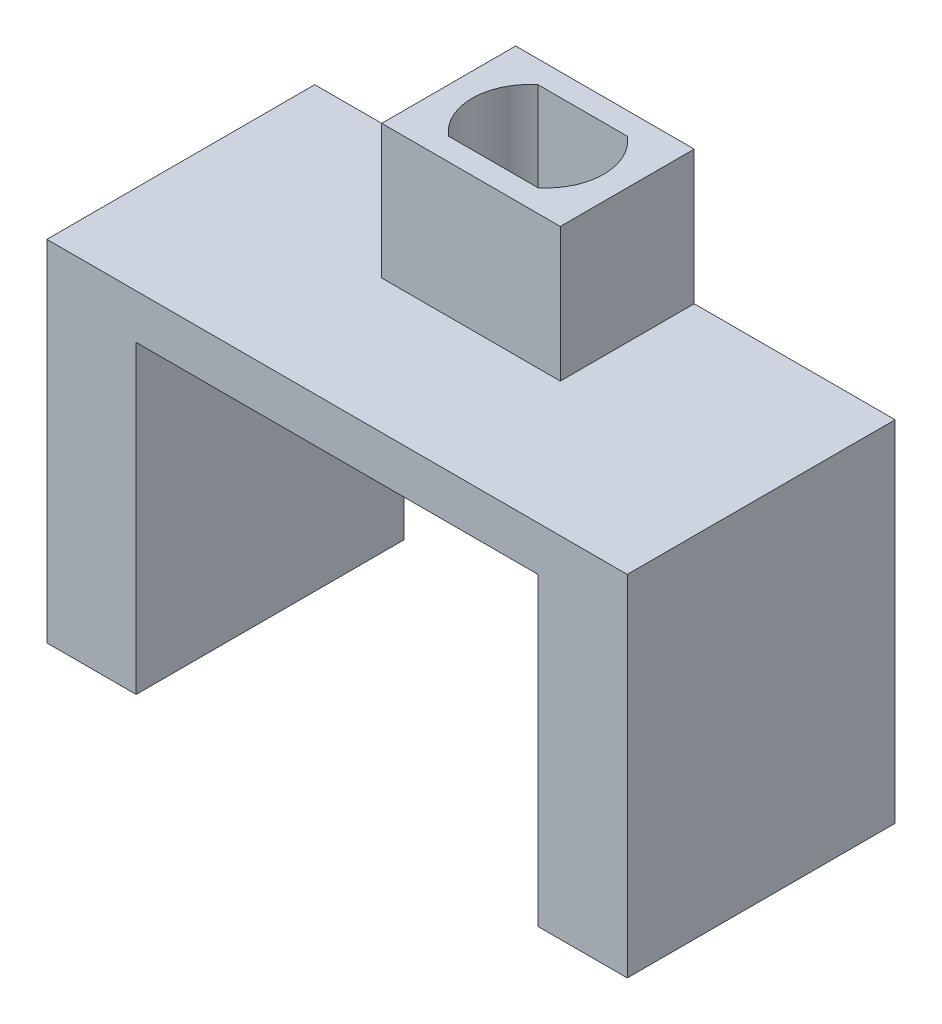
ISO-10303-21;
HEADER;
FILE_DESCRIPTION(('STEP AP214'),'2;1');
FILE_NAME('part.step','',(''),(''),'','','');
FILE_SCHEMA(('AUTOMOTIVE_DESIGN { 1 0 10303 214 1 1 1 1 }'));
ENDSEC;
DATA;
#1=APPLICATION_CONTEXT('core data for automotive mechanical design processes');
#2=APPLICATION_PROTOCOL_DEFINITION('international standard','automotive_design',2000,#1);
#3=PRODUCT_CONTEXT('',#1,'mechanical');
#4=PRODUCT('Part','Part','',(#3));
#5=PRODUCT_RELATED_PRODUCT_CATEGORY('part','',(#4));
#6=PRODUCT_DEFINITION_FORMATION('','',#4);
#7=PRODUCT_DEFINITION_CONTEXT('part definition',#1,'design');
#8=PRODUCT_DEFINITION('design','',#6,#7);
#9=PRODUCT_DEFINITION_SHAPE('','',#8);
#10=(LENGTH_UNIT() NAMED_UNIT(*) SI_UNIT(.MILLI.,.METRE.));
#11=(NAMED_UNIT(*) PLANE_ANGLE_UNIT() SI_UNIT($,.RADIAN.));
#12=(NAMED_UNIT(*) SI_UNIT($,.STERADIAN.) SOLID_ANGLE_UNIT());
#13=UNCERTAINTY_MEASURE_WITH_UNIT(LENGTH_MEASURE(1.E-05),#10,'distance_accuracy_value','');
#14=(GEOMETRIC_REPRESENTATION_CONTEXT(3) GLOBAL_UNCERTAINTY_ASSIGNED_CONTEXT((#13)) GLOBAL_UNIT_ASSIGNED_CONTEXT((#10,
#11,#12)) REPRESENTATION_CONTEXT('',''));
#15=CARTESIAN_POINT('',(0.,0.,0.));
#16=DIRECTION('',(0.,0.,1.));
#17=DIRECTION('',(1.,0.,0.));
#18=AXIS2_PLACEMENT_3D('',#15,#16,#17);
#19=CARTESIAN_POINT('',(0.,0.,0.));
#20=DIRECTION('',(0.,-1.,0.));
#21=DIRECTION('',(0.,0.,-1.));
#22=AXIS2_PLACEMENT_3D('',#19,#20,#21);
#23=PLANE('',#22);
#24=CARTESIAN_POINT('',(0.,0.,-7.5));
#25=DIRECTION('',(0.,1.,0.));
#26=DIRECTION('',(0.,0.,1.));
#27=AXIS2_PLACEMENT_3D('',#24,#25,#26);
#28=CIRCLE('',#27,1.85264170744092);
#29=CARTESIAN_POINT('',(0.,0.,-5.64735829255908));
#30=VERTEX_POINT('',#29);
#31=EDGE_CURVE('E226',#30,#30,#28,.T.);
#32=ORIENTED_EDGE('',*,*,#31,.T.);
#33=EDGE_LOOP('',(#32));
#34=FACE_BOUND('',#33,.T.);
#35=DIRECTION('',(1.,0.,0.));
#36=VECTOR('',#35,1.);
#37=CARTESIAN_POINT('',(-32.5,0.,15.));
#38=LINE('',#37,#36);
#39=CARTESIAN_POINT('',(-22.5,0.,15.));
#40=VERTEX_POINT('',#39);
#41=CARTESIAN_POINT('',(22.5,0.,15.));
#42=VERTEX_POINT('',#41);
#43=EDGE_CURVE('E52',#40,#42,#38,.T.);
#44=ORIENTED_EDGE('',*,*,#43,.F.);
#45=DIRECTION('',(0.,0.,1.));
#46=VECTOR('',#45,1.);
#47=CARTESIAN_POINT('',(-22.5,0.,-15.));
#48=LINE('',#47,#46);
#49=CARTESIAN_POINT('',(-22.5,0.,-15.));
#50=VERTEX_POINT('',#49);
#51=EDGE_CURVE('E156',#50,#40,#48,.T.);
#52=ORIENTED_EDGE('',*,*,#51,.F.);
#53=DIRECTION('',(-1.,0.,0.));
#54=VECTOR('',#53,1.);
#55=CARTESIAN_POINT('',(-32.5,0.,-15.));
#56=LINE('',#55,#54);
#57=CARTESIAN_POINT('',(22.5,0.,-15.));
#58=VERTEX_POINT('',#57);
#59=EDGE_CURVE('E165',#58,#50,#56,.T.);
#60=ORIENTED_EDGE('',*,*,#59,.F.);
#61=DIRECTION('',(0.,0.,-1.));
#62=VECTOR('',#61,1.);
#63=CARTESIAN_POINT('',(22.5,0.,-15.));
#64=LINE('',#63,#62);
#65=EDGE_CURVE('E202',#42,#58,#64,.T.);
#66=ORIENTED_EDGE('',*,*,#65,.F.);
#67=EDGE_LOOP('',(#44,#52,#60,#66));
#68=FACE_BOUND('',#67,.T.);
#69=ADVANCED_FACE('F37',(#34,#68),#23,.T.);
#70=CARTESIAN_POINT('',(0.,5.,0.));
#71=DIRECTION('',(0.,-1.,0.));
#72=DIRECTION('',(0.,0.,-1.));
#73=AXIS2_PLACEMENT_3D('',#70,#71,#72);
#74=PLANE('',#73);
#75=DIRECTION('',(0.,0.,-1.));
#76=VECTOR('',#75,1.);
#77=CARTESIAN_POINT('',(9.99999999999999,5.,-15.));
#78=LINE('',#77,#76);
#79=CARTESIAN_POINT('',(9.99999999999999,5.,0.));
#80=VERTEX_POINT('',#79);
#81=CARTESIAN_POINT('',(9.99999999999999,5.,-15.));
#82=VERTEX_POINT('',#81);
#83=EDGE_CURVE('E261',#80,#82,#78,.T.);
#84=ORIENTED_EDGE('',*,*,#83,.F.);
#85=DIRECTION('',(1.,0.,0.));
#86=VECTOR('',#85,1.);
#87=CARTESIAN_POINT('',(-10.,5.,0.));
#88=LINE('',#87,#86);
#89=CARTESIAN_POINT('',(-10.,5.,0.));
#90=VERTEX_POINT('',#89);
#91=EDGE_CURVE('E266',#90,#80,#88,.T.);
#92=ORIENTED_EDGE('',*,*,#91,.F.);
#93=DIRECTION('',(0.,0.,1.));
#94=VECTOR('',#93,1.);
#95=CARTESIAN_POINT('',(-10.,5.,-15.));
#96=LINE('',#95,#94);
#97=CARTESIAN_POINT('',(-10.,5.,-15.));
#98=VERTEX_POINT('',#97);
#99=EDGE_CURVE('E275',#98,#90,#96,.T.);
#100=ORIENTED_EDGE('',*,*,#99,.F.);
#101=DIRECTION('',(-1.,0.,0.));
#102=VECTOR('',#101,1.);
#103=CARTESIAN_POINT('',(-32.5,5.,-15.));
#104=LINE('',#103,#102);
#105=CARTESIAN_POINT('',(-32.5,5.,-15.));
#106=VERTEX_POINT('',#105);
#107=EDGE_CURVE('E289',#98,#106,#104,.T.);
#108=ORIENTED_EDGE('',*,*,#107,.T.);
#109=DIRECTION('',(0.,0.,1.));
#110=VECTOR('',#109,1.);
#111=CARTESIAN_POINT('',(-32.5,5.,15.));
#112=LINE('',#111,#110);
#113=CARTESIAN_POINT('',(-32.5,5.,15.));
#114=VERTEX_POINT('',#113);
#115=EDGE_CURVE('E195',#106,#114,#112,.T.);
#116=ORIENTED_EDGE('',*,*,#115,.T.);
#117=DIRECTION('',(1.,0.,0.));
#118=VECTOR('',#117,1.);
#119=CARTESIAN_POINT('',(-32.5,5.,15.));
#120=LINE('',#119,#118);
#121=CARTESIAN_POINT('',(32.5,5.,15.));
#122=VERTEX_POINT('',#121);
#123=EDGE_CURVE('E181',#114,#122,#120,.T.);
#124=ORIENTED_EDGE('',*,*,#123,.T.);
#125=DIRECTION('',(0.,0.,-1.));
#126=VECTOR('',#125,1.);
#127=CARTESIAN_POINT('',(32.5,5.,15.));
#128=LINE('',#127,#126);
#129=CARTESIAN_POINT('',(32.5,5.,-15.));
#130=VERTEX_POINT('',#129);
#131=EDGE_CURVE('E175',#122,#130,#128,.T.);
#132=ORIENTED_EDGE('',*,*,#131,.T.);
#133=EDGE_CURVE('E290',#130,#82,#104,.T.);
#134=ORIENTED_EDGE('',*,*,#133,.T.);
#135=EDGE_LOOP('',(#84,#92,#100,#108,#116,#124,#132,#134));
#136=FACE_BOUND('',#135,.T.);
#137=ADVANCED_FACE('F294',(#136),#74,.F.);
#138=CARTESIAN_POINT('',(32.5,5.,15.));
#139=DIRECTION('',(-1.,0.,0.));
#140=DIRECTION('',(0.,0.,1.));
#141=AXIS2_PLACEMENT_3D('',#138,#139,#140);
#142=PLANE('',#141);
#143=DIRECTION('',(0.,-1.,0.));
#144=VECTOR('',#143,1.);
#145=CARTESIAN_POINT('',(32.5,5.,15.));
#146=LINE('',#145,#144);
#147=CARTESIAN_POINT('',(32.5,-34.1462129049531,15.));
#148=VERTEX_POINT('',#147);
#149=EDGE_CURVE('E184',#122,#148,#146,.T.);
#150=ORIENTED_EDGE('',*,*,#149,.T.);
#151=DIRECTION('',(0.,0.,-1.));
#152=VECTOR('',#151,1.);
#153=CARTESIAN_POINT('',(32.5,-34.1462129049531,-15.));
#154=LINE('',#153,#152);
#155=CARTESIAN_POINT('',(32.5,-34.1462129049531,-15.));
#156=VERTEX_POINT('',#155);
#157=EDGE_CURVE('E216',#148,#156,#154,.T.);
#158=ORIENTED_EDGE('',*,*,#157,.T.);
#159=DIRECTION('',(0.,-1.,0.));
#160=VECTOR('',#159,1.);
#161=CARTESIAN_POINT('',(32.5,5.,-15.));
#162=LINE('',#161,#160);
#163=EDGE_CURVE('E11',#130,#156,#162,.T.);
#164=ORIENTED_EDGE('',*,*,#163,.F.);
#165=ORIENTED_EDGE('',*,*,#131,.F.);
#166=EDGE_LOOP('',(#150,#158,#164,#165));
#167=FACE_BOUND('',#166,.T.);
#168=ADVANCED_FACE('F39',(#167),#142,.F.);
#169=CARTESIAN_POINT('',(-32.5,5.,-15.));
#170=DIRECTION('',(0.,0.,1.));
#171=DIRECTION('',(1.,0.,0.));
#172=AXIS2_PLACEMENT_3D('',#169,#170,#171);
#173=PLANE('',#172);
#174=ORIENTED_EDGE('',*,*,#163,.T.);
#175=DIRECTION('',(-1.,0.,0.));
#176=VECTOR('',#175,1.);
#177=CARTESIAN_POINT('',(32.5,-34.1462129049531,-15.));
#178=LINE('',#177,#176);
#179=CARTESIAN_POINT('',(22.5,-34.1462129049531,-15.));
#180=VERTEX_POINT('',#179);
#181=EDGE_CURVE('E213',#156,#180,#178,.T.);
#182=ORIENTED_EDGE('',*,*,#181,.T.);
#183=DIRECTION('',(0.,1.,0.));
#184=VECTOR('',#183,1.);
#185=CARTESIAN_POINT('',(22.5,-65.7689895066369,-15.));
#186=LINE('',#185,#184);
#187=EDGE_CURVE('E171',#180,#58,#186,.T.);
#188=ORIENTED_EDGE('',*,*,#187,.T.);
#189=ORIENTED_EDGE('',*,*,#59,.T.);
#190=DIRECTION('',(0.,1.,0.));
#191=VECTOR('',#190,1.);
#192=CARTESIAN_POINT('',(-22.5,-65.7689895066369,-15.));
#193=LINE('',#192,#191);
#194=CARTESIAN_POINT('',(-22.5,-34.1462129049531,-15.));
#195=VERTEX_POINT('',#194);
#196=EDGE_CURVE('E152',#195,#50,#193,.T.);
#197=ORIENTED_EDGE('',*,*,#196,.F.);
#198=DIRECTION('',(-1.,0.,0.));
#199=VECTOR('',#198,1.);
#200=CARTESIAN_POINT('',(-32.5,-34.1462129049531,-15.));
#201=LINE('',#200,#199);
#202=CARTESIAN_POINT('',(-32.5,-34.1462129049531,-15.));
#203=VERTEX_POINT('',#202);
#204=EDGE_CURVE('E200',#195,#203,#201,.T.);
#205=ORIENTED_EDGE('',*,*,#204,.T.);
#206=DIRECTION('',(0.,-1.,0.));
#207=VECTOR('',#206,1.);
#208=CARTESIAN_POINT('',(-32.5,5.,-15.));
#209=LINE('',#208,#207);
#210=EDGE_CURVE('E45',#106,#203,#209,.T.);
#211=ORIENTED_EDGE('',*,*,#210,.F.);
#212=ORIENTED_EDGE('',*,*,#107,.F.);
#213=DIRECTION('',(0.,-1.,0.));
#214=VECTOR('',#213,1.);
#215=CARTESIAN_POINT('',(-10.,20.,-15.));
#216=LINE('',#215,#214);
#217=CARTESIAN_POINT('',(-10.,20.,-15.));
#218=VERTEX_POINT('',#217);
#219=EDGE_CURVE('E178',#218,#98,#216,.T.);
#220=ORIENTED_EDGE('',*,*,#219,.F.);
#221=DIRECTION('',(-1.,0.,0.));
#222=VECTOR('',#221,1.);
#223=CARTESIAN_POINT('',(-10.,20.,-15.));
#224=LINE('',#223,#222);
#225=CARTESIAN_POINT('',(9.99999999999999,20.,-15.));
#226=VERTEX_POINT('',#225);
#227=EDGE_CURVE('E265',#226,#218,#224,.T.);
#228=ORIENTED_EDGE('',*,*,#227,.F.);
#229=DIRECTION('',(0.,-1.,0.));
#230=VECTOR('',#229,1.);
#231=CARTESIAN_POINT('',(9.99999999999999,20.,-15.));
#232=LINE('',#231,#230);
#233=EDGE_CURVE('E173',#226,#82,#232,.T.);
#234=ORIENTED_EDGE('',*,*,#233,.T.);
#235=ORIENTED_EDGE('',*,*,#133,.F.);
#236=EDGE_LOOP('',(#174,#182,#188,#189,#197,#205,#211,#212,#220,#228,#234,#235));
#237=FACE_BOUND('',#236,.T.);
#238=ADVANCED_FACE('F168',(#237),#173,.F.);
#239=CARTESIAN_POINT('',(-32.5,5.,15.));
#240=DIRECTION('',(1.,0.,0.));
#241=DIRECTION('',(0.,0.,-1.));
#242=AXIS2_PLACEMENT_3D('',#239,#240,#241);
#243=PLANE('',#242);
#244=ORIENTED_EDGE('',*,*,#210,.T.);
#245=DIRECTION('',(0.,0.,1.));
#246=VECTOR('',#245,1.);
#247=CARTESIAN_POINT('',(-32.5,-34.1462129049531,-15.));
#248=LINE('',#247,#246);
#249=CARTESIAN_POINT('',(-32.5,-34.1462129049531,15.));
#250=VERTEX_POINT('',#249);
#251=EDGE_CURVE('E194',#203,#250,#248,.T.);
#252=ORIENTED_EDGE('',*,*,#251,.T.);
#253=DIRECTION('',(0.,-1.,0.));
#254=VECTOR('',#253,1.);
#255=CARTESIAN_POINT('',(-32.5,5.,15.));
#256=LINE('',#255,#254);
#257=EDGE_CURVE('E186',#114,#250,#256,.T.);
#258=ORIENTED_EDGE('',*,*,#257,.F.);
#259=ORIENTED_EDGE('',*,*,#115,.F.);
#260=EDGE_LOOP('',(#244,#252,#258,#259));
#261=FACE_BOUND('',#260,.T.);
#262=ADVANCED_FACE('F192',(#261),#243,.F.);
#263=CARTESIAN_POINT('',(-32.5,5.,15.));
#264=DIRECTION('',(0.,0.,-1.));
#265=DIRECTION('',(-1.,0.,0.));
#266=AXIS2_PLACEMENT_3D('',#263,#264,#265);
#267=PLANE('',#266);
#268=ORIENTED_EDGE('',*,*,#257,.T.);
#269=DIRECTION('',(1.,0.,0.));
#270=VECTOR('',#269,1.);
#271=CARTESIAN_POINT('',(-32.5,-34.1462129049531,15.));
#272=LINE('',#271,#270);
#273=CARTESIAN_POINT('',(-22.5,-34.1462129049531,15.));
#274=VERTEX_POINT('',#273);
#275=EDGE_CURVE('E161',#250,#274,#272,.T.);
#276=ORIENTED_EDGE('',*,*,#275,.T.);
#277=DIRECTION('',(0.,1.,0.));
#278=VECTOR('',#277,1.);
#279=CARTESIAN_POINT('',(-22.5,-65.7689895066369,15.));
#280=LINE('',#279,#278);
#281=EDGE_CURVE('E162',#274,#40,#280,.T.);
#282=ORIENTED_EDGE('',*,*,#281,.T.);
#283=ORIENTED_EDGE('',*,*,#43,.T.);
#284=DIRECTION('',(0.,1.,0.));
#285=VECTOR('',#284,1.);
#286=CARTESIAN_POINT('',(22.5,-65.7689895066369,15.));
#287=LINE('',#286,#285);
#288=CARTESIAN_POINT('',(22.5,-34.1462129049531,15.));
#289=VERTEX_POINT('',#288);
#290=EDGE_CURVE('E222',#289,#42,#287,.T.);
#291=ORIENTED_EDGE('',*,*,#290,.F.);
#292=DIRECTION('',(1.,0.,0.));
#293=VECTOR('',#292,1.);
#294=CARTESIAN_POINT('',(32.5,-34.1462129049531,15.));
#295=LINE('',#294,#293);
#296=EDGE_CURVE('E212',#289,#148,#295,.T.);
#297=ORIENTED_EDGE('',*,*,#296,.T.);
#298=ORIENTED_EDGE('',*,*,#149,.F.);
#299=ORIENTED_EDGE('',*,*,#123,.F.);
#300=EDGE_LOOP('',(#268,#276,#282,#283,#291,#297,#298,#299));
#301=FACE_BOUND('',#300,.T.);
#302=ADVANCED_FACE('F297',(#301),#267,.F.);
#303=CARTESIAN_POINT('',(9.99999999999999,20.,-15.));
#304=DIRECTION('',(-1.,0.,0.));
#305=DIRECTION('',(0.,0.,1.));
#306=AXIS2_PLACEMENT_3D('',#303,#304,#305);
#307=PLANE('',#306);
#308=ORIENTED_EDGE('',*,*,#83,.T.);
#309=ORIENTED_EDGE('',*,*,#233,.F.);
#310=DIRECTION('',(0.,0.,-1.));
#311=VECTOR('',#310,1.);
#312=CARTESIAN_POINT('',(9.99999999999999,20.,-15.));
#313=LINE('',#312,#311);
#314=CARTESIAN_POINT('',(9.99999999999999,20.,0.));
#315=VERTEX_POINT('',#314);
#316=EDGE_CURVE('E262',#315,#226,#313,.T.);
#317=ORIENTED_EDGE('',*,*,#316,.F.);
#318=DIRECTION('',(0.,-1.,0.));
#319=VECTOR('',#318,1.);
#320=CARTESIAN_POINT('',(9.99999999999999,20.,0.));
#321=LINE('',#320,#319);
#322=EDGE_CURVE('E272',#315,#80,#321,.T.);
#323=ORIENTED_EDGE('',*,*,#322,.T.);
#324=EDGE_LOOP('',(#308,#309,#317,#323));
#325=FACE_BOUND('',#324,.T.);
#326=ADVANCED_FACE('F327',(#325),#307,.F.);
#327=CARTESIAN_POINT('',(-10.,20.,-15.));
#328=DIRECTION('',(1.,0.,0.));
#329=DIRECTION('',(0.,0.,-1.));
#330=AXIS2_PLACEMENT_3D('',#327,#328,#329);
#331=PLANE('',#330);
#332=ORIENTED_EDGE('',*,*,#99,.T.);
#333=DIRECTION('',(0.,-1.,0.));
#334=VECTOR('',#333,1.);
#335=CARTESIAN_POINT('',(-10.,20.,0.));
#336=LINE('',#335,#334);
#337=CARTESIAN_POINT('',(-10.,20.,0.));
#338=VERTEX_POINT('',#337);
#339=EDGE_CURVE('E282',#338,#90,#336,.T.);
#340=ORIENTED_EDGE('',*,*,#339,.F.);
#341=DIRECTION('',(0.,0.,1.));
#342=VECTOR('',#341,1.);
#343=CARTESIAN_POINT('',(-10.,20.,-15.));
#344=LINE('',#343,#342);
#345=EDGE_CURVE('E268',#218,#338,#344,.T.);
#346=ORIENTED_EDGE('',*,*,#345,.F.);
#347=ORIENTED_EDGE('',*,*,#219,.T.);
#348=EDGE_LOOP('',(#332,#340,#346,#347));
#349=FACE_BOUND('',#348,.T.);
#350=ADVANCED_FACE('F350',(#349),#331,.F.);
#351=CARTESIAN_POINT('',(-10.,20.,0.));
#352=DIRECTION('',(0.,0.,-1.));
#353=DIRECTION('',(-1.,0.,0.));
#354=AXIS2_PLACEMENT_3D('',#351,#352,#353);
#355=PLANE('',#354);
#356=ORIENTED_EDGE('',*,*,#91,.T.);
#357=ORIENTED_EDGE('',*,*,#322,.F.);
#358=DIRECTION('',(1.,0.,0.));
#359=VECTOR('',#358,1.);
#360=CARTESIAN_POINT('',(-10.,20.,0.));
#361=LINE('',#360,#359);
#362=EDGE_CURVE('E270',#338,#315,#361,.T.);
#363=ORIENTED_EDGE('',*,*,#362,.F.);
#364=ORIENTED_EDGE('',*,*,#339,.T.);
#365=EDGE_LOOP('',(#356,#357,#363,#364));
#366=FACE_BOUND('',#365,.T.);
#367=ADVANCED_FACE('F359',(#366),#355,.F.);
#368=CARTESIAN_POINT('',(0.,20.,0.));
#369=DIRECTION('',(0.,1.,0.));
#370=DIRECTION('',(0.,0.,1.));
#371=AXIS2_PLACEMENT_3D('',#368,#369,#370);
#372=PLANE('',#371);
#373=DIRECTION('',(-1.,0.,0.));
#374=VECTOR('',#373,1.);
#375=CARTESIAN_POINT('',(-5.,20.,-12.5));
#376=LINE('',#375,#374);
#377=CARTESIAN_POINT('',(5.,20.,-12.5));
#378=VERTEX_POINT('',#377);
#379=CARTESIAN_POINT('',(-5.,20.,-12.5));
#380=VERTEX_POINT('',#379);
#381=EDGE_CURVE('E237',#378,#380,#376,.T.);
#382=ORIENTED_EDGE('',*,*,#381,.F.);
#383=CARTESIAN_POINT('',(0.926240285377159,20.,-7.5));
#384=DIRECTION('',(0.,1.,0.));
#385=DIRECTION('',(0.,0.,1.));
#386=AXIS2_PLACEMENT_3D('',#383,#384,#385);
#387=CIRCLE('',#386,6.44945875345241);
#388=CARTESIAN_POINT('',(5.,20.,-2.5));
#389=VERTEX_POINT('',#388);
#390=EDGE_CURVE('E229',#389,#378,#387,.T.);
#391=ORIENTED_EDGE('',*,*,#390,.F.);
#392=DIRECTION('',(1.,0.,0.));
#393=VECTOR('',#392,1.);
#394=CARTESIAN_POINT('',(-5.,20.,-2.5));
#395=LINE('',#394,#393);
#396=CARTESIAN_POINT('',(-5.,20.,-2.50000000000001));
#397=VERTEX_POINT('',#396);
#398=EDGE_CURVE('E60',#397,#389,#395,.T.);
#399=ORIENTED_EDGE('',*,*,#398,.F.);
#400=CARTESIAN_POINT('',(-0.926240285377159,20.,-7.5));
#401=DIRECTION('',(0.,1.,0.));
#402=DIRECTION('',(0.,0.,1.));
#403=AXIS2_PLACEMENT_3D('',#400,#401,#402);
#404=CIRCLE('',#403,6.44945875345241);
#405=EDGE_CURVE('E234',#380,#397,#404,.T.);
#406=ORIENTED_EDGE('',*,*,#405,.F.);
#407=EDGE_LOOP('',(#382,#391,#399,#406));
#408=FACE_BOUND('',#407,.T.);
#409=ORIENTED_EDGE('',*,*,#316,.T.);
#410=ORIENTED_EDGE('',*,*,#227,.T.);
#411=ORIENTED_EDGE('',*,*,#345,.T.);
#412=ORIENTED_EDGE('',*,*,#362,.T.);
#413=EDGE_LOOP('',(#409,#410,#411,#412));
#414=FACE_BOUND('',#413,.T.);
#415=ADVANCED_FACE('F369',(#408,#414),#372,.T.);
#416=CARTESIAN_POINT('',(0.,5.,0.));
#417=DIRECTION('',(0.,-1.,0.));
#418=DIRECTION('',(0.,0.,-1.));
#419=AXIS2_PLACEMENT_3D('',#416,#417,#418);
#420=PLANE('',#419);
#421=CARTESIAN_POINT('',(0.,5.,-7.5));
#422=DIRECTION('',(0.,1.,0.));
#423=DIRECTION('',(0.,0.,1.));
#424=AXIS2_PLACEMENT_3D('',#421,#422,#423);
#425=CIRCLE('',#424,1.85264170744092);
#426=CARTESIAN_POINT('',(0.,5.,-5.64735829255908));
#427=VERTEX_POINT('',#426);
#428=EDGE_CURVE('E219',#427,#427,#425,.T.);
#429=ORIENTED_EDGE('',*,*,#428,.F.);
#430=EDGE_LOOP('',(#429));
#431=FACE_BOUND('',#430,.T.);
#432=CARTESIAN_POINT('',(0.926240285377159,5.,-7.5));
#433=DIRECTION('',(0.,-1.,0.));
#434=DIRECTION('',(0.,0.,-1.));
#435=AXIS2_PLACEMENT_3D('',#432,#433,#434);
#436=CIRCLE('',#435,6.44945875345241);
#437=CARTESIAN_POINT('',(5.,5.,-2.5));
#438=VERTEX_POINT('',#437);
#439=CARTESIAN_POINT('',(5.,5.,-12.5));
#440=VERTEX_POINT('',#439);
#441=EDGE_CURVE('E245',#438,#440,#436,.F.);
#442=ORIENTED_EDGE('',*,*,#441,.T.);
#443=DIRECTION('',(-1.,0.,0.));
#444=VECTOR('',#443,1.);
#445=CARTESIAN_POINT('',(-5.,5.,-12.5));
#446=LINE('',#445,#444);
#447=CARTESIAN_POINT('',(-5.,5.,-12.5));
#448=VERTEX_POINT('',#447);
#449=EDGE_CURVE('E233',#440,#448,#446,.T.);
#450=ORIENTED_EDGE('',*,*,#449,.T.);
#451=CARTESIAN_POINT('',(-0.926240285377159,5.,-7.5));
#452=DIRECTION('',(0.,-1.,0.));
#453=DIRECTION('',(0.,0.,-1.));
#454=AXIS2_PLACEMENT_3D('',#451,#452,#453);
#455=CIRCLE('',#454,6.44945875345241);
#456=CARTESIAN_POINT('',(-5.,5.,-2.50000000000001));
#457=VERTEX_POINT('',#456);
#458=EDGE_CURVE('E254',#448,#457,#455,.F.);
#459=ORIENTED_EDGE('',*,*,#458,.T.);
#460=DIRECTION('',(1.,0.,0.));
#461=VECTOR('',#460,1.);
#462=CARTESIAN_POINT('',(-5.,5.,-2.5));
#463=LINE('',#462,#461);
#464=EDGE_CURVE('E250',#457,#438,#463,.T.);
#465=ORIENTED_EDGE('',*,*,#464,.T.);
#466=EDGE_LOOP('',(#442,#450,#459,#465));
#467=FACE_BOUND('',#466,.T.);
#468=ADVANCED_FACE('F379',(#431,#467),#420,.F.);
#469=CARTESIAN_POINT('',(-5.,-12.8214406052251,-12.5));
#470=DIRECTION('',(0.,0.,-1.));
#471=DIRECTION('',(-1.,0.,0.));
#472=AXIS2_PLACEMENT_3D('',#469,#470,#471);
#473=PLANE('',#472);
#474=DIRECTION('',(0.,1.,0.));
#475=VECTOR('',#474,1.);
#476=CARTESIAN_POINT('',(5.,-12.8214406052251,-12.5));
#477=LINE('',#476,#475);
#478=EDGE_CURVE('E248',#440,#378,#477,.T.);
#479=ORIENTED_EDGE('',*,*,#478,.T.);
#480=ORIENTED_EDGE('',*,*,#381,.T.);
#481=DIRECTION('',(0.,1.,0.));
#482=VECTOR('',#481,1.);
#483=CARTESIAN_POINT('',(-5.,-12.8214406052251,-12.5));
#484=LINE('',#483,#482);
#485=EDGE_CURVE('E244',#448,#380,#484,.T.);
#486=ORIENTED_EDGE('',*,*,#485,.F.);
#487=ORIENTED_EDGE('',*,*,#449,.F.);
#488=EDGE_LOOP('',(#479,#480,#486,#487));
#489=FACE_BOUND('',#488,.T.);
#490=ADVANCED_FACE('F387',(#489),#473,.F.);
#491=CARTESIAN_POINT('',(-0.926240285377159,-12.8214406052251,-7.5));
#492=DIRECTION('',(0.,1.,0.));
#493=DIRECTION('',(0.,0.,1.));
#494=AXIS2_PLACEMENT_3D('',#491,#492,#493);
#495=CYLINDRICAL_SURFACE('',#494,6.44945875345241);
#496=ORIENTED_EDGE('',*,*,#485,.T.);
#497=ORIENTED_EDGE('',*,*,#405,.T.);
#498=DIRECTION('',(0.,1.,0.));
#499=VECTOR('',#498,1.);
#500=CARTESIAN_POINT('',(-5.,-12.8214406052251,-2.50000000000001));
#501=LINE('',#500,#499);
#502=EDGE_CURVE('E253',#457,#397,#501,.T.);
#503=ORIENTED_EDGE('',*,*,#502,.F.);
#504=ORIENTED_EDGE('',*,*,#458,.F.);
#505=EDGE_LOOP('',(#496,#497,#503,#504));
#506=FACE_BOUND('',#505,.T.);
#507=ADVANCED_FACE('F392',(#506),#495,.F.);
#508=CARTESIAN_POINT('',(-5.,-12.8214406052251,-2.5));
#509=DIRECTION('',(0.,0.,1.));
#510=DIRECTION('',(1.,0.,0.));
#511=AXIS2_PLACEMENT_3D('',#508,#509,#510);
#512=PLANE('',#511);
#513=ORIENTED_EDGE('',*,*,#502,.T.);
#514=ORIENTED_EDGE('',*,*,#398,.T.);
#515=DIRECTION('',(0.,1.,0.));
#516=VECTOR('',#515,1.);
#517=CARTESIAN_POINT('',(5.,-12.8214406052251,-2.5));
#518=LINE('',#517,#516);
#519=EDGE_CURVE('E249',#438,#389,#518,.T.);
#520=ORIENTED_EDGE('',*,*,#519,.F.);
#521=ORIENTED_EDGE('',*,*,#464,.F.);
#522=EDGE_LOOP('',(#513,#514,#520,#521));
#523=FACE_BOUND('',#522,.T.);
#524=ADVANCED_FACE('F402',(#523),#512,.F.);
#525=CARTESIAN_POINT('',(0.926240285377159,-12.8214406052251,-7.5));
#526=DIRECTION('',(0.,1.,0.));
#527=DIRECTION('',(0.,0.,1.));
#528=AXIS2_PLACEMENT_3D('',#525,#526,#527);
#529=CYLINDRICAL_SURFACE('',#528,6.44945875345241);
#530=ORIENTED_EDGE('',*,*,#519,.T.);
#531=ORIENTED_EDGE('',*,*,#390,.T.);
#532=ORIENTED_EDGE('',*,*,#478,.F.);
#533=ORIENTED_EDGE('',*,*,#441,.F.);
#534=EDGE_LOOP('',(#530,#531,#532,#533));
#535=FACE_BOUND('',#534,.T.);
#536=ADVANCED_FACE('F313',(#535),#529,.F.);
#537=CARTESIAN_POINT('',(0.,0.,-7.5));
#538=DIRECTION('',(0.,1.,0.));
#539=DIRECTION('',(0.,0.,1.));
#540=AXIS2_PLACEMENT_3D('',#537,#538,#539);
#541=CYLINDRICAL_SURFACE('',#540,1.85264170744092);
#542=ORIENTED_EDGE('',*,*,#31,.F.);
#543=EDGE_LOOP('',(#542));
#544=FACE_BOUND('',#543,.T.);
#545=ORIENTED_EDGE('',*,*,#428,.T.);
#546=EDGE_LOOP('',(#545));
#547=FACE_BOUND('',#546,.T.);
#548=ADVANCED_FACE('F306',(#544,#547),#541,.F.);
#549=CARTESIAN_POINT('',(22.5,-65.7689895066369,-15.));
#550=DIRECTION('',(1.,0.,0.));
#551=DIRECTION('',(0.,0.,-1.));
#552=AXIS2_PLACEMENT_3D('',#549,#550,#551);
#553=PLANE('',#552);
#554=ORIENTED_EDGE('',*,*,#187,.F.);
#555=DIRECTION('',(0.,0.,1.));
#556=VECTOR('',#555,1.);
#557=CARTESIAN_POINT('',(22.5,-34.1462129049531,-15.));
#558=LINE('',#557,#556);
#559=EDGE_CURVE('E209',#180,#289,#558,.T.);
#560=ORIENTED_EDGE('',*,*,#559,.T.);
#561=ORIENTED_EDGE('',*,*,#290,.T.);
#562=ORIENTED_EDGE('',*,*,#65,.T.);
#563=EDGE_LOOP('',(#554,#560,#561,#562));
#564=FACE_BOUND('',#563,.T.);
#565=ADVANCED_FACE('F304',(#564),#553,.F.);
#566=CARTESIAN_POINT('',(37.3769211838211,-34.1462129049531,-68.4021186153826));
#567=DIRECTION('',(0.,1.,0.));
#568=DIRECTION('',(1.,0.,0.));
#569=AXIS2_PLACEMENT_3D('',#566,#567,#568);
#570=PLANE('',#569);
#571=ORIENTED_EDGE('',*,*,#296,.F.);
#572=ORIENTED_EDGE('',*,*,#559,.F.);
#573=ORIENTED_EDGE('',*,*,#181,.F.);
#574=ORIENTED_EDGE('',*,*,#157,.F.);
#575=EDGE_LOOP('',(#571,#572,#573,#574));
#576=FACE_BOUND('',#575,.T.);
#577=ADVANCED_FACE('F302',(#576),#570,.F.);
#578=CARTESIAN_POINT('',(-22.5,-65.7689895066369,-15.));
#579=DIRECTION('',(-1.,0.,0.));
#580=DIRECTION('',(0.,0.,1.));
#581=AXIS2_PLACEMENT_3D('',#578,#579,#580);
#582=PLANE('',#581);
#583=ORIENTED_EDGE('',*,*,#281,.F.);
#584=DIRECTION('',(0.,0.,-1.));
#585=VECTOR('',#584,1.);
#586=CARTESIAN_POINT('',(-22.5,-34.1462129049531,-15.));
#587=LINE('',#586,#585);
#588=EDGE_CURVE('E157',#274,#195,#587,.T.);
#589=ORIENTED_EDGE('',*,*,#588,.T.);
#590=ORIENTED_EDGE('',*,*,#196,.T.);
#591=ORIENTED_EDGE('',*,*,#51,.T.);
#592=EDGE_LOOP('',(#583,#589,#590,#591));
#593=FACE_BOUND('',#592,.T.);
#594=ADVANCED_FACE('F155',(#593),#582,.F.);
#595=CARTESIAN_POINT('',(37.3769211838211,-34.1462129049531,-68.4021186153826));
#596=DIRECTION('',(0.,1.,0.));
#597=DIRECTION('',(1.,0.,0.));
#598=AXIS2_PLACEMENT_3D('',#595,#596,#597);
#599=PLANE('',#598);
#600=ORIENTED_EDGE('',*,*,#204,.F.);
#601=ORIENTED_EDGE('',*,*,#588,.F.);
#602=ORIENTED_EDGE('',*,*,#275,.F.);
#603=ORIENTED_EDGE('',*,*,#251,.F.);
#604=EDGE_LOOP('',(#600,#601,#602,#603));
#605=FACE_BOUND('',#604,.T.);
#606=ADVANCED_FACE('F199',(#605),#599,.F.);
#607=CLOSED_SHELL('',(#69,#137,#168,#238,#262,#302,#326,#350,#367,#415,#468,#490,#507,#524,#536,
#548,#565,#577,#594,#606));
#608=MANIFOLD_SOLID_BREP('B2',#607);
#609=ADVANCED_BREP_SHAPE_REPRESENTATION('',(#18,#608),#14);
#610=SHAPE_DEFINITION_REPRESENTATION(#9,#609);
ENDSEC;
END-ISO-10303-21;
